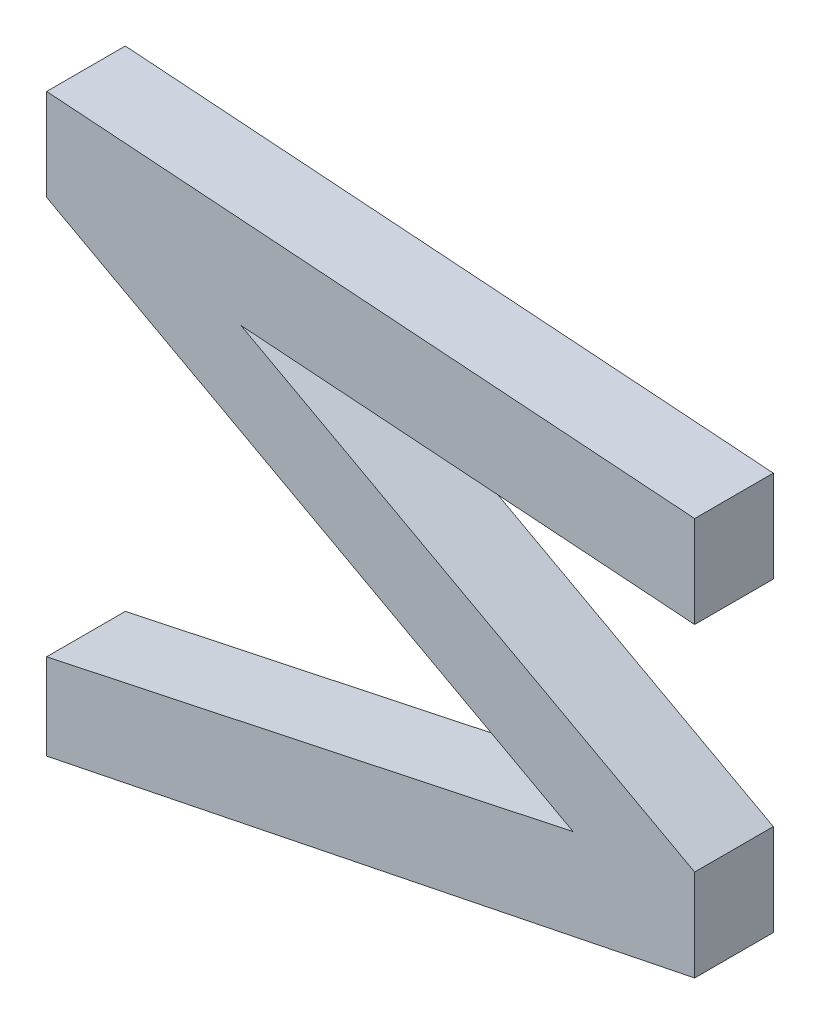
ISO-10303-21;
HEADER;
FILE_DESCRIPTION(('STEP AP214'),'2;1');
FILE_NAME('part.step','',(''),(''),'','','');
FILE_SCHEMA(('AUTOMOTIVE_DESIGN { 1 0 10303 214 1 1 1 1 }'));
ENDSEC;
DATA;
#1=APPLICATION_CONTEXT('core data for automotive mechanical design processes');
#2=APPLICATION_PROTOCOL_DEFINITION('international standard','automotive_design',2000,#1);
#3=PRODUCT_CONTEXT('',#1,'mechanical');
#4=PRODUCT('Part','Part','',(#3));
#5=PRODUCT_RELATED_PRODUCT_CATEGORY('part','',(#4));
#6=PRODUCT_DEFINITION_FORMATION('','',#4);
#7=PRODUCT_DEFINITION_CONTEXT('part definition',#1,'design');
#8=PRODUCT_DEFINITION('design','',#6,#7);
#9=PRODUCT_DEFINITION_SHAPE('','',#8);
#10=(LENGTH_UNIT() NAMED_UNIT(*) SI_UNIT(.MILLI.,.METRE.));
#11=(NAMED_UNIT(*) PLANE_ANGLE_UNIT() SI_UNIT($,.RADIAN.));
#12=(NAMED_UNIT(*) SI_UNIT($,.STERADIAN.) SOLID_ANGLE_UNIT());
#13=UNCERTAINTY_MEASURE_WITH_UNIT(LENGTH_MEASURE(1.E-05),#10,'distance_accuracy_value','');
#14=(GEOMETRIC_REPRESENTATION_CONTEXT(3) GLOBAL_UNCERTAINTY_ASSIGNED_CONTEXT((#13)) GLOBAL_UNIT_ASSIGNED_CONTEXT((#10,
#11,#12)) REPRESENTATION_CONTEXT('',''));
#15=CARTESIAN_POINT('',(0.,0.,0.));
#16=DIRECTION('',(0.,0.,1.));
#17=DIRECTION('',(1.,0.,0.));
#18=AXIS2_PLACEMENT_3D('',#15,#16,#17);
#19=CARTESIAN_POINT('',(-16.8386250303581,48.4772362065182,66.6890590934387));
#20=DIRECTION('',(1.,0.,0.));
#21=DIRECTION('',(0.,0.,-1.));
#22=AXIS2_PLACEMENT_3D('',#19,#20,#21);
#23=PLANE('',#22);
#24=DIRECTION('',(0.,1.,0.));
#25=VECTOR('',#24,1.);
#26=CARTESIAN_POINT('',(-16.8386250303581,48.4772362065182,74.3090590934387));
#27=LINE('',#26,#25);
#28=CARTESIAN_POINT('',(-16.8386250303581,39.5872362065182,74.3090590934387));
#29=VERTEX_POINT('',#28);
#30=CARTESIAN_POINT('',(-16.8386250303581,48.4772362065182,74.3090590934387));
#31=VERTEX_POINT('',#30);
#32=EDGE_CURVE('E144',#29,#31,#27,.T.);
#33=ORIENTED_EDGE('',*,*,#32,.F.);
#34=DIRECTION('',(0.,0.,1.));
#35=VECTOR('',#34,1.);
#36=CARTESIAN_POINT('',(-16.8386250303581,39.5872362065182,66.6890590934387));
#37=LINE('',#36,#35);
#38=CARTESIAN_POINT('',(-16.8386250303581,39.5872362065182,66.6890590934387));
#39=VERTEX_POINT('',#38);
#40=EDGE_CURVE('E11',#39,#29,#37,.T.);
#41=ORIENTED_EDGE('',*,*,#40,.F.);
#42=DIRECTION('',(0.,1.,0.));
#43=VECTOR('',#42,1.);
#44=CARTESIAN_POINT('',(-16.8386250303581,48.4772362065182,66.6890590934387));
#45=LINE('',#44,#43);
#46=CARTESIAN_POINT('',(-16.8386250303581,48.4772362065182,66.6890590934387));
#47=VERTEX_POINT('',#46);
#48=EDGE_CURVE('E168',#39,#47,#45,.T.);
#49=ORIENTED_EDGE('',*,*,#48,.T.);
#50=DIRECTION('',(0.,0.,1.));
#51=VECTOR('',#50,1.);
#52=CARTESIAN_POINT('',(-16.8386250303581,48.4772362065182,66.6890590934387));
#53=LINE('',#52,#51);
#54=EDGE_CURVE('E38',#47,#31,#53,.T.);
#55=ORIENTED_EDGE('',*,*,#54,.T.);
#56=EDGE_LOOP('',(#33,#41,#49,#55));
#57=FACE_BOUND('',#56,.T.);
#58=ADVANCED_FACE('F35',(#57),#23,.T.);
#59=CARTESIAN_POINT('',(-28.6045064331136,40.4205139262601,66.6890590934387));
#60=DIRECTION('',(-0.0706445857032249,-0.997501550129532,0.));
#61=DIRECTION('',(0.997501550129532,-0.0706445857032249,0.));
#62=AXIS2_PLACEMENT_3D('',#59,#60,#61);
#63=PLANE('',#62);
#64=DIRECTION('',(0.997501550129532,-0.0706445857032249,0.));
#65=VECTOR('',#64,1.);
#66=CARTESIAN_POINT('',(-28.6045064331136,40.4205139262601,74.3090590934387));
#67=LINE('',#66,#65);
#68=CARTESIAN_POINT('',(-60.7835890775757,42.6994857849331,74.3090590934387));
#69=VERTEX_POINT('',#68);
#70=EDGE_CURVE('E84',#69,#29,#67,.T.);
#71=ORIENTED_EDGE('',*,*,#70,.F.);
#72=DIRECTION('',(0.,0.,1.));
#73=VECTOR('',#72,1.);
#74=CARTESIAN_POINT('',(-60.7835890775757,42.6994857849331,66.6890590934387));
#75=LINE('',#74,#73);
#76=CARTESIAN_POINT('',(-60.7835890775757,42.6994857849331,66.6890590934387));
#77=VERTEX_POINT('',#76);
#78=EDGE_CURVE('E44',#77,#69,#75,.T.);
#79=ORIENTED_EDGE('',*,*,#78,.F.);
#80=DIRECTION('',(0.997501550129532,-0.0706445857032253,0.));
#81=VECTOR('',#80,1.);
#82=CARTESIAN_POINT('',(-28.6045064331136,40.4205139262601,66.6890590934387));
#83=LINE('',#82,#81);
#84=EDGE_CURVE('E52',#77,#39,#83,.T.);
#85=ORIENTED_EDGE('',*,*,#84,.T.);
#86=ORIENTED_EDGE('',*,*,#40,.T.);
#87=EDGE_LOOP('',(#71,#79,#85,#86));
#88=FACE_BOUND('',#87,.T.);
#89=ADVANCED_FACE('F226',(#88),#63,.T.);
#90=CARTESIAN_POINT('',(-60.7835890775757,42.6994857849331,66.6890590934387));
#91=DIRECTION('',(0.477345316516115,0.878715795237647,0.));
#92=DIRECTION('',(-0.878715795237647,0.477345316516115,0.));
#93=AXIS2_PLACEMENT_3D('',#90,#91,#92);
#94=PLANE('',#93);
#95=DIRECTION('',(-0.878715795237647,0.477345316516115,0.));
#96=VECTOR('',#95,1.);
#97=CARTESIAN_POINT('',(-60.7835890775757,42.6994857849331,74.3090590934387));
#98=LINE('',#97,#96);
#99=CARTESIAN_POINT('',(-16.8386250303581,18.8272362065183,74.3090590934387));
#100=VERTEX_POINT('',#99);
#101=EDGE_CURVE('E121',#100,#69,#98,.T.);
#102=ORIENTED_EDGE('',*,*,#101,.F.);
#103=DIRECTION('',(0.,0.,1.));
#104=VECTOR('',#103,1.);
#105=CARTESIAN_POINT('',(-16.8386250303581,18.8272362065183,66.6890590934387));
#106=LINE('',#105,#104);
#107=CARTESIAN_POINT('',(-16.8386250303581,18.8272362065183,66.6890590934387));
#108=VERTEX_POINT('',#107);
#109=EDGE_CURVE('E116',#108,#100,#106,.T.);
#110=ORIENTED_EDGE('',*,*,#109,.F.);
#111=DIRECTION('',(-0.878715795237647,0.477345316516115,0.));
#112=VECTOR('',#111,1.);
#113=CARTESIAN_POINT('',(-60.7835890775757,42.6994857849331,66.6890590934387));
#114=LINE('',#113,#112);
#115=EDGE_CURVE('E119',#108,#77,#114,.T.);
#116=ORIENTED_EDGE('',*,*,#115,.T.);
#117=ORIENTED_EDGE('',*,*,#78,.T.);
#118=EDGE_LOOP('',(#102,#110,#116,#117));
#119=FACE_BOUND('',#118,.T.);
#120=ADVANCED_FACE('F118',(#119),#94,.T.);
#121=CARTESIAN_POINT('',(-16.8386250303581,9.93723620651826,66.6890590934387));
#122=DIRECTION('',(1.,0.,0.));
#123=DIRECTION('',(0.,0.,-1.));
#124=AXIS2_PLACEMENT_3D('',#121,#122,#123);
#125=PLANE('',#124);
#126=DIRECTION('',(0.,1.,0.));
#127=VECTOR('',#126,1.);
#128=CARTESIAN_POINT('',(-16.8386250303581,9.93723620651826,74.3090590934387));
#129=LINE('',#128,#127);
#130=CARTESIAN_POINT('',(-16.8386250303581,9.93723620651826,74.3090590934387));
#131=VERTEX_POINT('',#130);
#132=EDGE_CURVE('E165',#131,#100,#129,.T.);
#133=ORIENTED_EDGE('',*,*,#132,.F.);
#134=DIRECTION('',(0.,0.,1.));
#135=VECTOR('',#134,1.);
#136=CARTESIAN_POINT('',(-16.8386250303581,9.93723620651826,66.6890590934387));
#137=LINE('',#136,#135);
#138=CARTESIAN_POINT('',(-16.8386250303581,9.93723620651826,66.6890590934387));
#139=VERTEX_POINT('',#138);
#140=EDGE_CURVE('E126',#139,#131,#137,.T.);
#141=ORIENTED_EDGE('',*,*,#140,.F.);
#142=DIRECTION('',(0.,1.,0.));
#143=VECTOR('',#142,1.);
#144=CARTESIAN_POINT('',(-16.8386250303581,9.93723620651826,66.6890590934387));
#145=LINE('',#144,#143);
#146=EDGE_CURVE('E133',#139,#108,#145,.T.);
#147=ORIENTED_EDGE('',*,*,#146,.T.);
#148=ORIENTED_EDGE('',*,*,#109,.T.);
#149=EDGE_LOOP('',(#133,#141,#147,#148));
#150=FACE_BOUND('',#149,.T.);
#151=ADVANCED_FACE('F136',(#150),#125,.T.);
#152=CARTESIAN_POINT('',(-16.8386250303581,9.93723620651826,66.6890590934387));
#153=DIRECTION('',(0.199356941159392,-0.979926941160192,0.));
#154=DIRECTION('',(0.979926941160192,0.199356941159392,0.));
#155=AXIS2_PLACEMENT_3D('',#152,#153,#154);
#156=PLANE('',#155);
#157=DIRECTION('',(0.979926941160192,0.199356941159392,0.));
#158=VECTOR('',#157,1.);
#159=CARTESIAN_POINT('',(-16.8386250303581,9.93723620651826,74.3090590934387));
#160=LINE('',#159,#158);
#161=CARTESIAN_POINT('',(-79.6020250303581,-2.83138859111139,74.3090590934387));
#162=VERTEX_POINT('',#161);
#163=EDGE_CURVE('E162',#162,#131,#160,.T.);
#164=ORIENTED_EDGE('',*,*,#163,.F.);
#165=DIRECTION('',(0.,0.,1.));
#166=VECTOR('',#165,1.);
#167=CARTESIAN_POINT('',(-79.6020250303581,-2.83138859111139,66.6890590934387));
#168=LINE('',#167,#166);
#169=CARTESIAN_POINT('',(-79.6020250303581,-2.83138859111139,66.6890590934387));
#170=VERTEX_POINT('',#169);
#171=EDGE_CURVE('E172',#170,#162,#168,.T.);
#172=ORIENTED_EDGE('',*,*,#171,.F.);
#173=DIRECTION('',(0.979926941160192,0.199356941159392,0.));
#174=VECTOR('',#173,1.);
#175=CARTESIAN_POINT('',(-16.8386250303581,9.93723620651826,66.6890590934387));
#176=LINE('',#175,#174);
#177=EDGE_CURVE('E137',#170,#139,#176,.T.);
#178=ORIENTED_EDGE('',*,*,#177,.T.);
#179=ORIENTED_EDGE('',*,*,#140,.T.);
#180=EDGE_LOOP('',(#164,#172,#178,#179));
#181=FACE_BOUND('',#180,.T.);
#182=ADVANCED_FACE('F190',(#181),#156,.T.);
#183=CARTESIAN_POINT('',(-79.6020250303581,-2.83138859111139,66.6890590934387));
#184=DIRECTION('',(-1.,0.,0.));
#185=DIRECTION('',(0.,0.,1.));
#186=AXIS2_PLACEMENT_3D('',#183,#184,#185);
#187=PLANE('',#186);
#188=DIRECTION('',(0.,-1.,0.));
#189=VECTOR('',#188,1.);
#190=CARTESIAN_POINT('',(-79.6020250303581,-2.83138859111139,74.3090590934387));
#191=LINE('',#190,#189);
#192=CARTESIAN_POINT('',(-79.6020250303581,5.49981140888861,74.3090590934387));
#193=VERTEX_POINT('',#192);
#194=EDGE_CURVE('E159',#193,#162,#191,.T.);
#195=ORIENTED_EDGE('',*,*,#194,.F.);
#196=DIRECTION('',(0.,0.,1.));
#197=VECTOR('',#196,1.);
#198=CARTESIAN_POINT('',(-79.6020250303581,5.49981140888861,66.6890590934387));
#199=LINE('',#198,#197);
#200=CARTESIAN_POINT('',(-79.6020250303581,5.49981140888861,66.6890590934387));
#201=VERTEX_POINT('',#200);
#202=EDGE_CURVE('E174',#201,#193,#199,.T.);
#203=ORIENTED_EDGE('',*,*,#202,.F.);
#204=DIRECTION('',(0.,-1.,0.));
#205=VECTOR('',#204,1.);
#206=CARTESIAN_POINT('',(-79.6020250303581,-2.83138859111139,66.6890590934387));
#207=LINE('',#206,#205);
#208=EDGE_CURVE('E139',#201,#170,#207,.T.);
#209=ORIENTED_EDGE('',*,*,#208,.T.);
#210=ORIENTED_EDGE('',*,*,#171,.T.);
#211=EDGE_LOOP('',(#195,#203,#209,#210));
#212=FACE_BOUND('',#211,.T.);
#213=ADVANCED_FACE('F196',(#212),#187,.T.);
#214=CARTESIAN_POINT('',(-61.627708464524,9.31654779219386,66.6890590934387));
#215=DIRECTION('',(-0.207712650301713,0.978189886936396,0.));
#216=DIRECTION('',(-0.978189886936396,-0.207712650301713,0.));
#217=AXIS2_PLACEMENT_3D('',#214,#215,#216);
#218=PLANE('',#217);
#219=DIRECTION('',(-0.978189886936396,-0.207712650301713,0.));
#220=VECTOR('',#219,1.);
#221=CARTESIAN_POINT('',(-61.627708464524,9.31654779219386,74.3090590934387));
#222=LINE('',#221,#220);
#223=CARTESIAN_POINT('',(-28.6045064331136,16.3288231254383,74.3090590934387));
#224=VERTEX_POINT('',#223);
#225=EDGE_CURVE('E156',#224,#193,#222,.T.);
#226=ORIENTED_EDGE('',*,*,#225,.F.);
#227=DIRECTION('',(0.,0.,1.));
#228=VECTOR('',#227,1.);
#229=CARTESIAN_POINT('',(-28.6045064331136,16.3288231254383,66.6890590934387));
#230=LINE('',#229,#228);
#231=CARTESIAN_POINT('',(-28.6045064331136,16.3288231254383,66.6890590934387));
#232=VERTEX_POINT('',#231);
#233=EDGE_CURVE('E176',#232,#224,#230,.T.);
#234=ORIENTED_EDGE('',*,*,#233,.F.);
#235=DIRECTION('',(-0.978189886936395,-0.207712650301715,0.));
#236=VECTOR('',#235,1.);
#237=CARTESIAN_POINT('',(-28.6045064331136,16.3288231254383,66.6890590934387));
#238=LINE('',#237,#236);
#239=EDGE_CURVE('E197',#232,#201,#238,.T.);
#240=ORIENTED_EDGE('',*,*,#239,.T.);
#241=ORIENTED_EDGE('',*,*,#202,.T.);
#242=EDGE_LOOP('',(#226,#234,#240,#241));
#243=FACE_BOUND('',#242,.T.);
#244=ADVANCED_FACE('F216',(#243),#218,.T.);
#245=CARTESIAN_POINT('',(-79.6020250303581,44.0322362065183,66.6890590934387));
#246=DIRECTION('',(-0.477345316516115,-0.878715795237647,0.));
#247=DIRECTION('',(0.878715795237647,-0.477345316516115,0.));
#248=AXIS2_PLACEMENT_3D('',#245,#246,#247);
#249=PLANE('',#248);
#250=DIRECTION('',(0.878715795237647,-0.477345316516115,0.));
#251=VECTOR('',#250,1.);
#252=CARTESIAN_POINT('',(-79.6020250303581,44.0322362065183,74.3090590934387));
#253=LINE('',#252,#251);
#254=CARTESIAN_POINT('',(-79.6020250303581,44.0322362065183,74.3090590934387));
#255=VERTEX_POINT('',#254);
#256=EDGE_CURVE('E153',#255,#224,#253,.T.);
#257=ORIENTED_EDGE('',*,*,#256,.F.);
#258=DIRECTION('',(0.,0.,1.));
#259=VECTOR('',#258,1.);
#260=CARTESIAN_POINT('',(-79.6020250303581,44.0322362065183,66.6890590934387));
#261=LINE('',#260,#259);
#262=CARTESIAN_POINT('',(-79.6020250303581,44.0322362065183,66.6890590934387));
#263=VERTEX_POINT('',#262);
#264=EDGE_CURVE('E179',#263,#255,#261,.T.);
#265=ORIENTED_EDGE('',*,*,#264,.F.);
#266=DIRECTION('',(0.878715795237647,-0.477345316516115,0.));
#267=VECTOR('',#266,1.);
#268=CARTESIAN_POINT('',(-79.6020250303581,44.0322362065183,66.6890590934387));
#269=LINE('',#268,#267);
#270=EDGE_CURVE('E198',#263,#232,#269,.T.);
#271=ORIENTED_EDGE('',*,*,#270,.T.);
#272=ORIENTED_EDGE('',*,*,#233,.T.);
#273=EDGE_LOOP('',(#257,#265,#271,#272));
#274=FACE_BOUND('',#273,.T.);
#275=ADVANCED_FACE('F214',(#274),#249,.T.);
#276=CARTESIAN_POINT('',(-79.6020250303581,52.9222362065182,66.6890590934387));
#277=DIRECTION('',(-1.,0.,0.));
#278=DIRECTION('',(0.,0.,1.));
#279=AXIS2_PLACEMENT_3D('',#276,#277,#278);
#280=PLANE('',#279);
#281=DIRECTION('',(0.,-1.,0.));
#282=VECTOR('',#281,1.);
#283=CARTESIAN_POINT('',(-79.6020250303581,52.9222362065182,74.3090590934387));
#284=LINE('',#283,#282);
#285=CARTESIAN_POINT('',(-79.6020250303581,52.9222362065182,74.3090590934387));
#286=VERTEX_POINT('',#285);
#287=EDGE_CURVE('E150',#286,#255,#284,.T.);
#288=ORIENTED_EDGE('',*,*,#287,.F.);
#289=DIRECTION('',(0.,0.,1.));
#290=VECTOR('',#289,1.);
#291=CARTESIAN_POINT('',(-79.6020250303581,52.9222362065182,66.6890590934387));
#292=LINE('',#291,#290);
#293=CARTESIAN_POINT('',(-79.6020250303581,52.9222362065182,66.6890590934387));
#294=VERTEX_POINT('',#293);
#295=EDGE_CURVE('E180',#294,#286,#292,.T.);
#296=ORIENTED_EDGE('',*,*,#295,.F.);
#297=DIRECTION('',(0.,-1.,0.));
#298=VECTOR('',#297,1.);
#299=CARTESIAN_POINT('',(-79.6020250303581,52.9222362065182,66.6890590934387));
#300=LINE('',#299,#298);
#301=EDGE_CURVE('E203',#294,#263,#300,.T.);
#302=ORIENTED_EDGE('',*,*,#301,.T.);
#303=ORIENTED_EDGE('',*,*,#264,.T.);
#304=EDGE_LOOP('',(#288,#296,#302,#303));
#305=FACE_BOUND('',#304,.T.);
#306=ADVANCED_FACE('F211',(#305),#280,.T.);
#307=CARTESIAN_POINT('',(-16.8386250303581,48.4772362065182,66.6890590934387));
#308=DIRECTION('',(0.0706445857032248,0.997501550129532,0.));
#309=DIRECTION('',(-0.997501550129532,0.0706445857032248,0.));
#310=AXIS2_PLACEMENT_3D('',#307,#308,#309);
#311=PLANE('',#310);
#312=DIRECTION('',(-0.997501550129532,0.0706445857032248,0.));
#313=VECTOR('',#312,1.);
#314=CARTESIAN_POINT('',(-16.8386250303581,48.4772362065182,74.3090590934387));
#315=LINE('',#314,#313);
#316=EDGE_CURVE('E147',#31,#286,#315,.T.);
#317=ORIENTED_EDGE('',*,*,#316,.F.);
#318=ORIENTED_EDGE('',*,*,#54,.F.);
#319=DIRECTION('',(-0.997501550129532,0.0706445857032248,0.));
#320=VECTOR('',#319,1.);
#321=CARTESIAN_POINT('',(-16.8386250303581,48.4772362065182,66.6890590934387));
#322=LINE('',#321,#320);
#323=EDGE_CURVE('E206',#47,#294,#322,.T.);
#324=ORIENTED_EDGE('',*,*,#323,.T.);
#325=ORIENTED_EDGE('',*,*,#295,.T.);
#326=EDGE_LOOP('',(#317,#318,#324,#325));
#327=FACE_BOUND('',#326,.T.);
#328=ADVANCED_FACE('F184',(#327),#311,.T.);
#329=CARTESIAN_POINT('',(0.,0.,66.6890590934387));
#330=DIRECTION('',(0.,0.,1.));
#331=DIRECTION('',(1.,0.,0.));
#332=AXIS2_PLACEMENT_3D('',#329,#330,#331);
#333=PLANE('',#332);
#334=ORIENTED_EDGE('',*,*,#48,.F.);
#335=ORIENTED_EDGE('',*,*,#84,.F.);
#336=ORIENTED_EDGE('',*,*,#115,.F.);
#337=ORIENTED_EDGE('',*,*,#146,.F.);
#338=ORIENTED_EDGE('',*,*,#177,.F.);
#339=ORIENTED_EDGE('',*,*,#208,.F.);
#340=ORIENTED_EDGE('',*,*,#239,.F.);
#341=ORIENTED_EDGE('',*,*,#270,.F.);
#342=ORIENTED_EDGE('',*,*,#301,.F.);
#343=ORIENTED_EDGE('',*,*,#323,.F.);
#344=EDGE_LOOP('',(#334,#335,#336,#337,#338,#339,#340,#341,#342,#343));
#345=FACE_BOUND('',#344,.T.);
#346=ADVANCED_FACE('F131',(#345),#333,.F.);
#347=CARTESIAN_POINT('',(0.,0.,74.3090590934387));
#348=DIRECTION('',(0.,0.,1.));
#349=DIRECTION('',(1.,0.,0.));
#350=AXIS2_PLACEMENT_3D('',#347,#348,#349);
#351=PLANE('',#350);
#352=ORIENTED_EDGE('',*,*,#32,.T.);
#353=ORIENTED_EDGE('',*,*,#316,.T.);
#354=ORIENTED_EDGE('',*,*,#287,.T.);
#355=ORIENTED_EDGE('',*,*,#256,.T.);
#356=ORIENTED_EDGE('',*,*,#225,.T.);
#357=ORIENTED_EDGE('',*,*,#194,.T.);
#358=ORIENTED_EDGE('',*,*,#163,.T.);
#359=ORIENTED_EDGE('',*,*,#132,.T.);
#360=ORIENTED_EDGE('',*,*,#101,.T.);
#361=ORIENTED_EDGE('',*,*,#70,.T.);
#362=EDGE_LOOP('',(#352,#353,#354,#355,#356,#357,#358,#359,#360,#361));
#363=FACE_BOUND('',#362,.T.);
#364=ADVANCED_FACE('F186',(#363),#351,.T.);
#365=CLOSED_SHELL('',(#58,#89,#120,#151,#182,#213,#244,#275,#306,#328,#346,#364));
#366=MANIFOLD_SOLID_BREP('B2',#365);
#367=ADVANCED_BREP_SHAPE_REPRESENTATION('',(#18,#366),#14);
#368=SHAPE_DEFINITION_REPRESENTATION(#9,#367);
ENDSEC;
END-ISO-10303-21;
